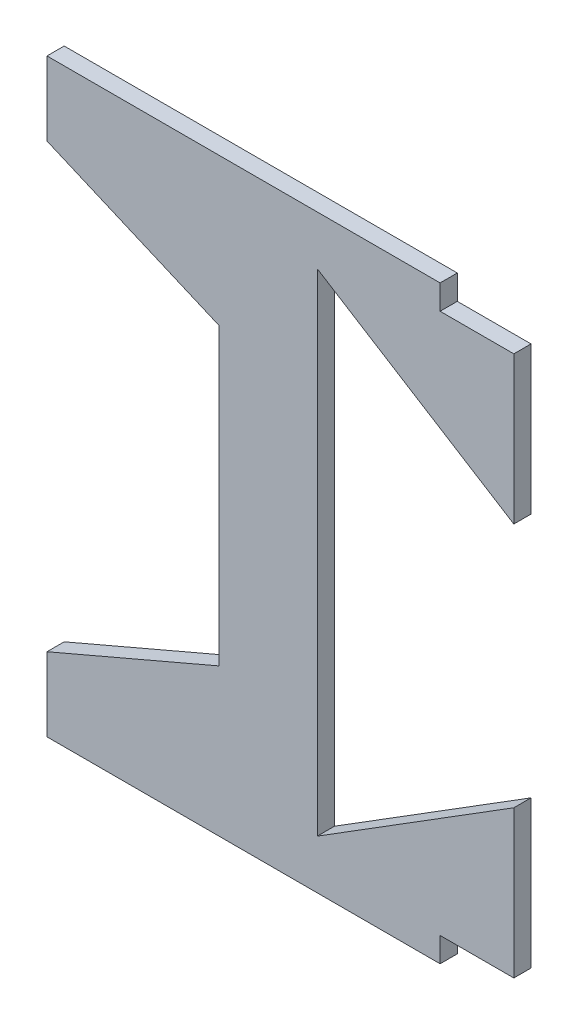
ISO-10303-21;
HEADER;
FILE_DESCRIPTION(('STEP AP214'),'2;1');
FILE_NAME('part.step','',(''),(''),'','','');
FILE_SCHEMA(('AUTOMOTIVE_DESIGN { 1 0 10303 214 1 1 1 1 }'));
ENDSEC;
DATA;
#1=APPLICATION_CONTEXT('core data for automotive mechanical design processes');
#2=APPLICATION_PROTOCOL_DEFINITION('international standard','automotive_design',2000,#1);
#3=PRODUCT_CONTEXT('',#1,'mechanical');
#4=PRODUCT('Part','Part','',(#3));
#5=PRODUCT_RELATED_PRODUCT_CATEGORY('part','',(#4));
#6=PRODUCT_DEFINITION_FORMATION('','',#4);
#7=PRODUCT_DEFINITION_CONTEXT('part definition',#1,'design');
#8=PRODUCT_DEFINITION('design','',#6,#7);
#9=PRODUCT_DEFINITION_SHAPE('','',#8);
#10=(LENGTH_UNIT() NAMED_UNIT(*) SI_UNIT(.MILLI.,.METRE.));
#11=(NAMED_UNIT(*) PLANE_ANGLE_UNIT() SI_UNIT($,.RADIAN.));
#12=(NAMED_UNIT(*) SI_UNIT($,.STERADIAN.) SOLID_ANGLE_UNIT());
#13=UNCERTAINTY_MEASURE_WITH_UNIT(LENGTH_MEASURE(1.E-05),#10,'distance_accuracy_value','');
#14=(GEOMETRIC_REPRESENTATION_CONTEXT(3) GLOBAL_UNCERTAINTY_ASSIGNED_CONTEXT((#13)) GLOBAL_UNIT_ASSIGNED_CONTEXT((#10,
#11,#12)) REPRESENTATION_CONTEXT('',''));
#15=CARTESIAN_POINT('',(0.,0.,0.));
#16=DIRECTION('',(0.,0.,1.));
#17=DIRECTION('',(1.,0.,0.));
#18=AXIS2_PLACEMENT_3D('',#15,#16,#17);
#19=CARTESIAN_POINT('',(30.2854704894107,-30.,3.5));
#20=DIRECTION('',(0.393919298579168,-0.919145030018058,0.));
#21=DIRECTION('',(0.919145030018058,0.393919298579168,0.));
#22=AXIS2_PLACEMENT_3D('',#19,#20,#21);
#23=PLANE('',#22);
#24=DIRECTION('',(-0.919145030018058,-0.393919298579168,0.));
#25=VECTOR('',#24,1.);
#26=CARTESIAN_POINT('',(30.2854704894107,-30.,0.));
#27=LINE('',#26,#25);
#28=CARTESIAN_POINT('',(30.2854704894107,-30.,0.));
#29=VERTEX_POINT('',#28);
#30=CARTESIAN_POINT('',(-4.71452951058928,-45.,0.));
#31=VERTEX_POINT('',#30);
#32=EDGE_CURVE('E188',#29,#31,#27,.T.);
#33=ORIENTED_EDGE('',*,*,#32,.T.);
#34=DIRECTION('',(0.,0.,-1.));
#35=VECTOR('',#34,1.);
#36=CARTESIAN_POINT('',(-4.71452951058928,-45.,3.5));
#37=LINE('',#36,#35);
#38=CARTESIAN_POINT('',(-4.71452951058928,-45.,3.5));
#39=VERTEX_POINT('',#38);
#40=EDGE_CURVE('E11',#39,#31,#37,.T.);
#41=ORIENTED_EDGE('',*,*,#40,.F.);
#42=DIRECTION('',(-0.919145030018058,-0.393919298579168,0.));
#43=VECTOR('',#42,1.);
#44=CARTESIAN_POINT('',(30.2854704894107,-30.,3.5));
#45=LINE('',#44,#43);
#46=CARTESIAN_POINT('',(30.2854704894107,-30.,3.5));
#47=VERTEX_POINT('',#46);
#48=EDGE_CURVE('E234',#47,#39,#45,.T.);
#49=ORIENTED_EDGE('',*,*,#48,.F.);
#50=DIRECTION('',(0.,0.,-1.));
#51=VECTOR('',#50,1.);
#52=CARTESIAN_POINT('',(30.2854704894107,-30.,3.5));
#53=LINE('',#52,#51);
#54=EDGE_CURVE('E184',#47,#29,#53,.T.);
#55=ORIENTED_EDGE('',*,*,#54,.T.);
#56=EDGE_LOOP('',(#33,#41,#49,#55));
#57=FACE_BOUND('',#56,.T.);
#58=ADVANCED_FACE('F39',(#57),#23,.F.);
#59=CARTESIAN_POINT('',(-4.71452951058928,-45.,3.5));
#60=DIRECTION('',(1.,0.,0.));
#61=DIRECTION('',(0.,1.,0.));
#62=AXIS2_PLACEMENT_3D('',#59,#60,#61);
#63=PLANE('',#62);
#64=DIRECTION('',(0.,-1.,0.));
#65=VECTOR('',#64,1.);
#66=CARTESIAN_POINT('',(-4.71452951058928,-45.,0.));
#67=LINE('',#66,#65);
#68=CARTESIAN_POINT('',(-4.71452951058927,-60.,0.));
#69=VERTEX_POINT('',#68);
#70=EDGE_CURVE('E192',#31,#69,#67,.T.);
#71=ORIENTED_EDGE('',*,*,#70,.T.);
#72=DIRECTION('',(0.,0.,-1.));
#73=VECTOR('',#72,1.);
#74=CARTESIAN_POINT('',(-4.71452951058927,-60.,3.5));
#75=LINE('',#74,#73);
#76=CARTESIAN_POINT('',(-4.71452951058927,-60.,3.5));
#77=VERTEX_POINT('',#76);
#78=EDGE_CURVE('E48',#77,#69,#75,.T.);
#79=ORIENTED_EDGE('',*,*,#78,.F.);
#80=DIRECTION('',(0.,-1.,0.));
#81=VECTOR('',#80,1.);
#82=CARTESIAN_POINT('',(-4.71452951058928,-45.,3.5));
#83=LINE('',#82,#81);
#84=EDGE_CURVE('E123',#39,#77,#83,.T.);
#85=ORIENTED_EDGE('',*,*,#84,.F.);
#86=ORIENTED_EDGE('',*,*,#40,.T.);
#87=EDGE_LOOP('',(#71,#79,#85,#86));
#88=FACE_BOUND('',#87,.T.);
#89=ADVANCED_FACE('F356',(#88),#63,.F.);
#90=CARTESIAN_POINT('',(-4.71452951058927,-60.,3.5));
#91=DIRECTION('',(0.,1.,0.));
#92=DIRECTION('',(0.,0.,1.));
#93=AXIS2_PLACEMENT_3D('',#90,#91,#92);
#94=PLANE('',#93);
#95=DIRECTION('',(1.,0.,0.));
#96=VECTOR('',#95,1.);
#97=CARTESIAN_POINT('',(-4.71452951058927,-60.,0.));
#98=LINE('',#97,#96);
#99=CARTESIAN_POINT('',(75.2854704894107,-60.,0.));
#100=VERTEX_POINT('',#99);
#101=EDGE_CURVE('E195',#69,#100,#98,.T.);
#102=ORIENTED_EDGE('',*,*,#101,.T.);
#103=DIRECTION('',(0.,0.,-1.));
#104=VECTOR('',#103,1.);
#105=CARTESIAN_POINT('',(75.2854704894107,-60.,3.5));
#106=LINE('',#105,#104);
#107=CARTESIAN_POINT('',(75.2854704894107,-60.,3.5));
#108=VERTEX_POINT('',#107);
#109=EDGE_CURVE('E277',#108,#100,#106,.T.);
#110=ORIENTED_EDGE('',*,*,#109,.F.);
#111=DIRECTION('',(1.,0.,0.));
#112=VECTOR('',#111,1.);
#113=CARTESIAN_POINT('',(-4.71452951058927,-60.,3.5));
#114=LINE('',#113,#112);
#115=EDGE_CURVE('E287',#77,#108,#114,.T.);
#116=ORIENTED_EDGE('',*,*,#115,.F.);
#117=ORIENTED_EDGE('',*,*,#78,.T.);
#118=EDGE_LOOP('',(#102,#110,#116,#117));
#119=FACE_BOUND('',#118,.T.);
#120=ADVANCED_FACE('F285',(#119),#94,.F.);
#121=CARTESIAN_POINT('',(75.2854704894107,-60.,3.5));
#122=DIRECTION('',(-1.,0.,0.));
#123=DIRECTION('',(0.,-1.,0.));
#124=AXIS2_PLACEMENT_3D('',#121,#122,#123);
#125=PLANE('',#124);
#126=DIRECTION('',(0.,1.,0.));
#127=VECTOR('',#126,1.);
#128=CARTESIAN_POINT('',(75.2854704894107,-60.,0.));
#129=LINE('',#128,#127);
#130=CARTESIAN_POINT('',(75.2854704894108,-55.,0.));
#131=VERTEX_POINT('',#130);
#132=EDGE_CURVE('E198',#100,#131,#129,.T.);
#133=ORIENTED_EDGE('',*,*,#132,.T.);
#134=DIRECTION('',(0.,0.,-1.));
#135=VECTOR('',#134,1.);
#136=CARTESIAN_POINT('',(75.2854704894108,-55.,3.5));
#137=LINE('',#136,#135);
#138=CARTESIAN_POINT('',(75.2854704894108,-55.,3.5));
#139=VERTEX_POINT('',#138);
#140=EDGE_CURVE('E273',#139,#131,#137,.T.);
#141=ORIENTED_EDGE('',*,*,#140,.F.);
#142=DIRECTION('',(0.,1.,0.));
#143=VECTOR('',#142,1.);
#144=CARTESIAN_POINT('',(75.2854704894107,-60.,3.5));
#145=LINE('',#144,#143);
#146=EDGE_CURVE('E306',#108,#139,#145,.T.);
#147=ORIENTED_EDGE('',*,*,#146,.F.);
#148=ORIENTED_EDGE('',*,*,#109,.T.);
#149=EDGE_LOOP('',(#133,#141,#147,#148));
#150=FACE_BOUND('',#149,.T.);
#151=ADVANCED_FACE('F296',(#150),#125,.F.);
#152=CARTESIAN_POINT('',(75.2854704894108,-55.,3.5));
#153=DIRECTION('',(0.,1.,0.));
#154=DIRECTION('',(0.,0.,1.));
#155=AXIS2_PLACEMENT_3D('',#152,#153,#154);
#156=PLANE('',#155);
#157=DIRECTION('',(1.,0.,0.));
#158=VECTOR('',#157,1.);
#159=CARTESIAN_POINT('',(75.2854704894108,-55.,0.));
#160=LINE('',#159,#158);
#161=CARTESIAN_POINT('',(90.2854704894108,-55.,0.));
#162=VERTEX_POINT('',#161);
#163=EDGE_CURVE('E201',#131,#162,#160,.T.);
#164=ORIENTED_EDGE('',*,*,#163,.T.);
#165=DIRECTION('',(0.,0.,-1.));
#166=VECTOR('',#165,1.);
#167=CARTESIAN_POINT('',(90.2854704894108,-55.,3.5));
#168=LINE('',#167,#166);
#169=CARTESIAN_POINT('',(90.2854704894108,-55.,3.5));
#170=VERTEX_POINT('',#169);
#171=EDGE_CURVE('E269',#170,#162,#168,.T.);
#172=ORIENTED_EDGE('',*,*,#171,.F.);
#173=DIRECTION('',(1.,0.,0.));
#174=VECTOR('',#173,1.);
#175=CARTESIAN_POINT('',(75.2854704894108,-55.,3.5));
#176=LINE('',#175,#174);
#177=EDGE_CURVE('E302',#139,#170,#176,.T.);
#178=ORIENTED_EDGE('',*,*,#177,.F.);
#179=ORIENTED_EDGE('',*,*,#140,.T.);
#180=EDGE_LOOP('',(#164,#172,#178,#179));
#181=FACE_BOUND('',#180,.T.);
#182=ADVANCED_FACE('F300',(#181),#156,.F.);
#183=CARTESIAN_POINT('',(90.2854704894108,-55.,3.5));
#184=DIRECTION('',(-1.,0.,0.));
#185=DIRECTION('',(0.,-1.,0.));
#186=AXIS2_PLACEMENT_3D('',#183,#184,#185);
#187=PLANE('',#186);
#188=DIRECTION('',(0.,1.,0.));
#189=VECTOR('',#188,1.);
#190=CARTESIAN_POINT('',(90.2854704894108,-55.,0.));
#191=LINE('',#190,#189);
#192=CARTESIAN_POINT('',(90.2854704894107,-25.,0.));
#193=VERTEX_POINT('',#192);
#194=EDGE_CURVE('E204',#162,#193,#191,.T.);
#195=ORIENTED_EDGE('',*,*,#194,.T.);
#196=DIRECTION('',(0.,0.,-1.));
#197=VECTOR('',#196,1.);
#198=CARTESIAN_POINT('',(90.2854704894107,-25.,3.5));
#199=LINE('',#198,#197);
#200=CARTESIAN_POINT('',(90.2854704894107,-25.,3.5));
#201=VERTEX_POINT('',#200);
#202=EDGE_CURVE('E265',#201,#193,#199,.T.);
#203=ORIENTED_EDGE('',*,*,#202,.F.);
#204=DIRECTION('',(0.,1.,0.));
#205=VECTOR('',#204,1.);
#206=CARTESIAN_POINT('',(90.2854704894108,-55.,3.5));
#207=LINE('',#206,#205);
#208=EDGE_CURVE('E305',#170,#201,#207,.T.);
#209=ORIENTED_EDGE('',*,*,#208,.F.);
#210=ORIENTED_EDGE('',*,*,#171,.T.);
#211=EDGE_LOOP('',(#195,#203,#209,#210));
#212=FACE_BOUND('',#211,.T.);
#213=ADVANCED_FACE('F369',(#212),#187,.F.);
#214=CARTESIAN_POINT('',(90.2854704894107,-25.,3.5));
#215=DIRECTION('',(0.52999894000318,-0.847998304005088,0.));
#216=DIRECTION('',(0.847998304005088,0.52999894000318,0.));
#217=AXIS2_PLACEMENT_3D('',#214,#215,#216);
#218=PLANE('',#217);
#219=DIRECTION('',(-0.847998304005088,-0.52999894000318,0.));
#220=VECTOR('',#219,1.);
#221=CARTESIAN_POINT('',(90.2854704894107,-25.,0.));
#222=LINE('',#221,#220);
#223=CARTESIAN_POINT('',(50.2854704894108,-50.,0.));
#224=VERTEX_POINT('',#223);
#225=EDGE_CURVE('E207',#193,#224,#222,.T.);
#226=ORIENTED_EDGE('',*,*,#225,.T.);
#227=DIRECTION('',(0.,0.,-1.));
#228=VECTOR('',#227,1.);
#229=CARTESIAN_POINT('',(50.2854704894108,-50.,3.5));
#230=LINE('',#229,#228);
#231=CARTESIAN_POINT('',(50.2854704894108,-50.,3.5));
#232=VERTEX_POINT('',#231);
#233=EDGE_CURVE('E261',#232,#224,#230,.T.);
#234=ORIENTED_EDGE('',*,*,#233,.F.);
#235=DIRECTION('',(-0.847998304005088,-0.52999894000318,0.));
#236=VECTOR('',#235,1.);
#237=CARTESIAN_POINT('',(90.2854704894107,-25.,3.5));
#238=LINE('',#237,#236);
#239=EDGE_CURVE('E310',#201,#232,#238,.T.);
#240=ORIENTED_EDGE('',*,*,#239,.F.);
#241=ORIENTED_EDGE('',*,*,#202,.T.);
#242=EDGE_LOOP('',(#226,#234,#240,#241));
#243=FACE_BOUND('',#242,.T.);
#244=ADVANCED_FACE('F372',(#243),#218,.F.);
#245=CARTESIAN_POINT('',(50.2854704894108,-50.,3.5));
#246=DIRECTION('',(-1.,0.,0.));
#247=DIRECTION('',(0.,0.,1.));
#248=AXIS2_PLACEMENT_3D('',#245,#246,#247);
#249=PLANE('',#248);
#250=DIRECTION('',(0.,1.,0.));
#251=VECTOR('',#250,1.);
#252=CARTESIAN_POINT('',(50.2854704894108,-50.,0.));
#253=LINE('',#252,#251);
#254=CARTESIAN_POINT('',(50.2854704894108,50.,0.));
#255=VERTEX_POINT('',#254);
#256=EDGE_CURVE('E210',#224,#255,#253,.T.);
#257=ORIENTED_EDGE('',*,*,#256,.T.);
#258=DIRECTION('',(0.,0.,-1.));
#259=VECTOR('',#258,1.);
#260=CARTESIAN_POINT('',(50.2854704894108,50.,3.5));
#261=LINE('',#260,#259);
#262=CARTESIAN_POINT('',(50.2854704894108,50.,3.5));
#263=VERTEX_POINT('',#262);
#264=EDGE_CURVE('E257',#263,#255,#261,.T.);
#265=ORIENTED_EDGE('',*,*,#264,.F.);
#266=DIRECTION('',(0.,1.,0.));
#267=VECTOR('',#266,1.);
#268=CARTESIAN_POINT('',(50.2854704894108,-50.,3.5));
#269=LINE('',#268,#267);
#270=EDGE_CURVE('E317',#232,#263,#269,.T.);
#271=ORIENTED_EDGE('',*,*,#270,.F.);
#272=ORIENTED_EDGE('',*,*,#233,.T.);
#273=EDGE_LOOP('',(#257,#265,#271,#272));
#274=FACE_BOUND('',#273,.T.);
#275=ADVANCED_FACE('F376',(#274),#249,.F.);
#276=CARTESIAN_POINT('',(90.2854704894107,25.,3.5));
#277=DIRECTION('',(0.52999894000318,0.847998304005088,0.));
#278=DIRECTION('',(-0.847998304005088,0.52999894000318,0.));
#279=AXIS2_PLACEMENT_3D('',#276,#277,#278);
#280=PLANE('',#279);
#281=DIRECTION('',(0.847998304005088,-0.52999894000318,0.));
#282=VECTOR('',#281,1.);
#283=CARTESIAN_POINT('',(90.2854704894107,25.,0.));
#284=LINE('',#283,#282);
#285=CARTESIAN_POINT('',(90.2854704894107,25.,0.));
#286=VERTEX_POINT('',#285);
#287=EDGE_CURVE('E213',#255,#286,#284,.T.);
#288=ORIENTED_EDGE('',*,*,#287,.T.);
#289=DIRECTION('',(0.,0.,-1.));
#290=VECTOR('',#289,1.);
#291=CARTESIAN_POINT('',(90.2854704894107,25.,3.5));
#292=LINE('',#291,#290);
#293=CARTESIAN_POINT('',(90.2854704894107,25.,3.5));
#294=VERTEX_POINT('',#293);
#295=EDGE_CURVE('E253',#294,#286,#292,.T.);
#296=ORIENTED_EDGE('',*,*,#295,.F.);
#297=DIRECTION('',(0.847998304005088,-0.52999894000318,0.));
#298=VECTOR('',#297,1.);
#299=CARTESIAN_POINT('',(90.2854704894107,25.,3.5));
#300=LINE('',#299,#298);
#301=EDGE_CURVE('E320',#263,#294,#300,.T.);
#302=ORIENTED_EDGE('',*,*,#301,.F.);
#303=ORIENTED_EDGE('',*,*,#264,.T.);
#304=EDGE_LOOP('',(#288,#296,#302,#303));
#305=FACE_BOUND('',#304,.T.);
#306=ADVANCED_FACE('F380',(#305),#280,.F.);
#307=CARTESIAN_POINT('',(90.2854704894108,55.,3.5));
#308=DIRECTION('',(-1.,0.,0.));
#309=DIRECTION('',(0.,-1.,0.));
#310=AXIS2_PLACEMENT_3D('',#307,#308,#309);
#311=PLANE('',#310);
#312=DIRECTION('',(0.,1.,0.));
#313=VECTOR('',#312,1.);
#314=CARTESIAN_POINT('',(90.2854704894108,55.,0.));
#315=LINE('',#314,#313);
#316=CARTESIAN_POINT('',(90.2854704894108,55.,0.));
#317=VERTEX_POINT('',#316);
#318=EDGE_CURVE('E216',#286,#317,#315,.T.);
#319=ORIENTED_EDGE('',*,*,#318,.T.);
#320=DIRECTION('',(0.,0.,-1.));
#321=VECTOR('',#320,1.);
#322=CARTESIAN_POINT('',(90.2854704894108,55.,3.5));
#323=LINE('',#322,#321);
#324=CARTESIAN_POINT('',(90.2854704894108,55.,3.5));
#325=VERTEX_POINT('',#324);
#326=EDGE_CURVE('E249',#325,#317,#323,.T.);
#327=ORIENTED_EDGE('',*,*,#326,.F.);
#328=DIRECTION('',(0.,1.,0.));
#329=VECTOR('',#328,1.);
#330=CARTESIAN_POINT('',(90.2854704894108,55.,3.5));
#331=LINE('',#330,#329);
#332=EDGE_CURVE('E323',#294,#325,#331,.T.);
#333=ORIENTED_EDGE('',*,*,#332,.F.);
#334=ORIENTED_EDGE('',*,*,#295,.T.);
#335=EDGE_LOOP('',(#319,#327,#333,#334));
#336=FACE_BOUND('',#335,.T.);
#337=ADVANCED_FACE('F384',(#336),#311,.F.);
#338=CARTESIAN_POINT('',(75.2854704894108,55.,3.5));
#339=DIRECTION('',(0.,-1.,0.));
#340=DIRECTION('',(0.,0.,-1.));
#341=AXIS2_PLACEMENT_3D('',#338,#339,#340);
#342=PLANE('',#341);
#343=DIRECTION('',(-1.,0.,0.));
#344=VECTOR('',#343,1.);
#345=CARTESIAN_POINT('',(75.2854704894108,55.,0.));
#346=LINE('',#345,#344);
#347=CARTESIAN_POINT('',(75.2854704894108,55.,0.));
#348=VERTEX_POINT('',#347);
#349=EDGE_CURVE('E219',#317,#348,#346,.T.);
#350=ORIENTED_EDGE('',*,*,#349,.T.);
#351=DIRECTION('',(0.,0.,-1.));
#352=VECTOR('',#351,1.);
#353=CARTESIAN_POINT('',(75.2854704894108,55.,3.5));
#354=LINE('',#353,#352);
#355=CARTESIAN_POINT('',(75.2854704894108,55.,3.5));
#356=VERTEX_POINT('',#355);
#357=EDGE_CURVE('E245',#356,#348,#354,.T.);
#358=ORIENTED_EDGE('',*,*,#357,.F.);
#359=DIRECTION('',(-1.,0.,0.));
#360=VECTOR('',#359,1.);
#361=CARTESIAN_POINT('',(75.2854704894108,55.,3.5));
#362=LINE('',#361,#360);
#363=EDGE_CURVE('E326',#325,#356,#362,.T.);
#364=ORIENTED_EDGE('',*,*,#363,.F.);
#365=ORIENTED_EDGE('',*,*,#326,.T.);
#366=EDGE_LOOP('',(#350,#358,#364,#365));
#367=FACE_BOUND('',#366,.T.);
#368=ADVANCED_FACE('F388',(#367),#342,.F.);
#369=CARTESIAN_POINT('',(75.2854704894107,60.,3.5));
#370=DIRECTION('',(-1.,0.,0.));
#371=DIRECTION('',(0.,-1.,0.));
#372=AXIS2_PLACEMENT_3D('',#369,#370,#371);
#373=PLANE('',#372);
#374=DIRECTION('',(0.,1.,0.));
#375=VECTOR('',#374,1.);
#376=CARTESIAN_POINT('',(75.2854704894107,60.,0.));
#377=LINE('',#376,#375);
#378=CARTESIAN_POINT('',(75.2854704894107,60.,0.));
#379=VERTEX_POINT('',#378);
#380=EDGE_CURVE('E222',#348,#379,#377,.T.);
#381=ORIENTED_EDGE('',*,*,#380,.T.);
#382=DIRECTION('',(0.,0.,-1.));
#383=VECTOR('',#382,1.);
#384=CARTESIAN_POINT('',(75.2854704894107,60.,3.5));
#385=LINE('',#384,#383);
#386=CARTESIAN_POINT('',(75.2854704894107,60.,3.5));
#387=VERTEX_POINT('',#386);
#388=EDGE_CURVE('E241',#387,#379,#385,.T.);
#389=ORIENTED_EDGE('',*,*,#388,.F.);
#390=DIRECTION('',(0.,1.,0.));
#391=VECTOR('',#390,1.);
#392=CARTESIAN_POINT('',(75.2854704894107,60.,3.5));
#393=LINE('',#392,#391);
#394=EDGE_CURVE('E329',#356,#387,#393,.T.);
#395=ORIENTED_EDGE('',*,*,#394,.F.);
#396=ORIENTED_EDGE('',*,*,#357,.T.);
#397=EDGE_LOOP('',(#381,#389,#395,#396));
#398=FACE_BOUND('',#397,.T.);
#399=ADVANCED_FACE('F337',(#398),#373,.F.);
#400=CARTESIAN_POINT('',(-4.71452951058927,60.,3.5));
#401=DIRECTION('',(0.,-1.,0.));
#402=DIRECTION('',(0.,0.,-1.));
#403=AXIS2_PLACEMENT_3D('',#400,#401,#402);
#404=PLANE('',#403);
#405=DIRECTION('',(-1.,0.,0.));
#406=VECTOR('',#405,1.);
#407=CARTESIAN_POINT('',(-4.71452951058927,60.,0.));
#408=LINE('',#407,#406);
#409=CARTESIAN_POINT('',(-4.71452951058927,60.,0.));
#410=VERTEX_POINT('',#409);
#411=EDGE_CURVE('E225',#379,#410,#408,.T.);
#412=ORIENTED_EDGE('',*,*,#411,.T.);
#413=DIRECTION('',(0.,0.,-1.));
#414=VECTOR('',#413,1.);
#415=CARTESIAN_POINT('',(-4.71452951058927,60.,3.5));
#416=LINE('',#415,#414);
#417=CARTESIAN_POINT('',(-4.71452951058927,60.,3.5));
#418=VERTEX_POINT('',#417);
#419=EDGE_CURVE('E177',#418,#410,#416,.T.);
#420=ORIENTED_EDGE('',*,*,#419,.F.);
#421=DIRECTION('',(-1.,0.,0.));
#422=VECTOR('',#421,1.);
#423=CARTESIAN_POINT('',(-4.71452951058927,60.,3.5));
#424=LINE('',#423,#422);
#425=EDGE_CURVE('E166',#387,#418,#424,.T.);
#426=ORIENTED_EDGE('',*,*,#425,.F.);
#427=ORIENTED_EDGE('',*,*,#388,.T.);
#428=EDGE_LOOP('',(#412,#420,#426,#427));
#429=FACE_BOUND('',#428,.T.);
#430=ADVANCED_FACE('F341',(#429),#404,.F.);
#431=CARTESIAN_POINT('',(-4.71452951058928,45.,3.5));
#432=DIRECTION('',(1.,0.,0.));
#433=DIRECTION('',(0.,1.,0.));
#434=AXIS2_PLACEMENT_3D('',#431,#432,#433);
#435=PLANE('',#434);
#436=DIRECTION('',(0.,-1.,0.));
#437=VECTOR('',#436,1.);
#438=CARTESIAN_POINT('',(-4.71452951058928,45.,0.));
#439=LINE('',#438,#437);
#440=CARTESIAN_POINT('',(-4.71452951058928,45.,0.));
#441=VERTEX_POINT('',#440);
#442=EDGE_CURVE('E175',#410,#441,#439,.T.);
#443=ORIENTED_EDGE('',*,*,#442,.T.);
#444=DIRECTION('',(0.,0.,-1.));
#445=VECTOR('',#444,1.);
#446=CARTESIAN_POINT('',(-4.71452951058928,45.,3.5));
#447=LINE('',#446,#445);
#448=CARTESIAN_POINT('',(-4.71452951058928,45.,3.5));
#449=VERTEX_POINT('',#448);
#450=EDGE_CURVE('E172',#449,#441,#447,.T.);
#451=ORIENTED_EDGE('',*,*,#450,.F.);
#452=DIRECTION('',(0.,-1.,0.));
#453=VECTOR('',#452,1.);
#454=CARTESIAN_POINT('',(-4.71452951058928,45.,3.5));
#455=LINE('',#454,#453);
#456=EDGE_CURVE('E160',#418,#449,#455,.T.);
#457=ORIENTED_EDGE('',*,*,#456,.F.);
#458=ORIENTED_EDGE('',*,*,#419,.T.);
#459=EDGE_LOOP('',(#443,#451,#457,#458));
#460=FACE_BOUND('',#459,.T.);
#461=ADVANCED_FACE('F173',(#460),#435,.F.);
#462=CARTESIAN_POINT('',(30.2854704894107,30.,3.5));
#463=DIRECTION('',(0.393919298579168,0.919145030018058,0.));
#464=DIRECTION('',(-0.919145030018058,0.393919298579168,0.));
#465=AXIS2_PLACEMENT_3D('',#462,#463,#464);
#466=PLANE('',#465);
#467=DIRECTION('',(0.919145030018058,-0.393919298579168,0.));
#468=VECTOR('',#467,1.);
#469=CARTESIAN_POINT('',(30.2854704894107,30.,0.));
#470=LINE('',#469,#468);
#471=CARTESIAN_POINT('',(30.2854704894107,30.,0.));
#472=VERTEX_POINT('',#471);
#473=EDGE_CURVE('E109',#441,#472,#470,.T.);
#474=ORIENTED_EDGE('',*,*,#473,.T.);
#475=DIRECTION('',(0.,0.,-1.));
#476=VECTOR('',#475,1.);
#477=CARTESIAN_POINT('',(30.2854704894107,30.,3.5));
#478=LINE('',#477,#476);
#479=CARTESIAN_POINT('',(30.2854704894107,30.,3.5));
#480=VERTEX_POINT('',#479);
#481=EDGE_CURVE('E178',#480,#472,#478,.T.);
#482=ORIENTED_EDGE('',*,*,#481,.F.);
#483=DIRECTION('',(0.919145030018058,-0.393919298579168,0.));
#484=VECTOR('',#483,1.);
#485=CARTESIAN_POINT('',(30.2854704894107,30.,3.5));
#486=LINE('',#485,#484);
#487=EDGE_CURVE('E164',#449,#480,#486,.T.);
#488=ORIENTED_EDGE('',*,*,#487,.F.);
#489=ORIENTED_EDGE('',*,*,#450,.T.);
#490=EDGE_LOOP('',(#474,#482,#488,#489));
#491=FACE_BOUND('',#490,.T.);
#492=ADVANCED_FACE('F180',(#491),#466,.F.);
#493=CARTESIAN_POINT('',(30.2854704894107,30.,3.5));
#494=DIRECTION('',(1.,0.,0.));
#495=DIRECTION('',(0.,0.,-1.));
#496=AXIS2_PLACEMENT_3D('',#493,#494,#495);
#497=PLANE('',#496);
#498=DIRECTION('',(0.,-1.,0.));
#499=VECTOR('',#498,1.);
#500=CARTESIAN_POINT('',(30.2854704894107,30.,0.));
#501=LINE('',#500,#499);
#502=EDGE_CURVE('E115',#472,#29,#501,.T.);
#503=ORIENTED_EDGE('',*,*,#502,.T.);
#504=ORIENTED_EDGE('',*,*,#54,.F.);
#505=DIRECTION('',(0.,-1.,0.));
#506=VECTOR('',#505,1.);
#507=CARTESIAN_POINT('',(30.2854704894107,30.,3.5));
#508=LINE('',#507,#506);
#509=EDGE_CURVE('E56',#480,#47,#508,.T.);
#510=ORIENTED_EDGE('',*,*,#509,.F.);
#511=ORIENTED_EDGE('',*,*,#481,.T.);
#512=EDGE_LOOP('',(#503,#504,#510,#511));
#513=FACE_BOUND('',#512,.T.);
#514=ADVANCED_FACE('F345',(#513),#497,.F.);
#515=CARTESIAN_POINT('',(0.,0.,3.5));
#516=DIRECTION('',(0.,0.,1.));
#517=DIRECTION('',(1.,0.,0.));
#518=AXIS2_PLACEMENT_3D('',#515,#516,#517);
#519=PLANE('',#518);
#520=ORIENTED_EDGE('',*,*,#48,.T.);
#521=ORIENTED_EDGE('',*,*,#84,.T.);
#522=ORIENTED_EDGE('',*,*,#115,.T.);
#523=ORIENTED_EDGE('',*,*,#146,.T.);
#524=ORIENTED_EDGE('',*,*,#177,.T.);
#525=ORIENTED_EDGE('',*,*,#208,.T.);
#526=ORIENTED_EDGE('',*,*,#239,.T.);
#527=ORIENTED_EDGE('',*,*,#270,.T.);
#528=ORIENTED_EDGE('',*,*,#301,.T.);
#529=ORIENTED_EDGE('',*,*,#332,.T.);
#530=ORIENTED_EDGE('',*,*,#363,.T.);
#531=ORIENTED_EDGE('',*,*,#394,.T.);
#532=ORIENTED_EDGE('',*,*,#425,.T.);
#533=ORIENTED_EDGE('',*,*,#456,.T.);
#534=ORIENTED_EDGE('',*,*,#487,.T.);
#535=ORIENTED_EDGE('',*,*,#509,.T.);
#536=EDGE_LOOP('',(#520,#521,#522,#523,#524,#525,#526,#527,#528,#529,#530,#531,#532,#533,#534,#535));
#537=FACE_BOUND('',#536,.T.);
#538=ADVANCED_FACE('F162',(#537),#519,.T.);
#539=CARTESIAN_POINT('',(0.,0.,0.));
#540=DIRECTION('',(0.,0.,1.));
#541=DIRECTION('',(1.,0.,0.));
#542=AXIS2_PLACEMENT_3D('',#539,#540,#541);
#543=PLANE('',#542);
#544=ORIENTED_EDGE('',*,*,#32,.F.);
#545=ORIENTED_EDGE('',*,*,#502,.F.);
#546=ORIENTED_EDGE('',*,*,#473,.F.);
#547=ORIENTED_EDGE('',*,*,#442,.F.);
#548=ORIENTED_EDGE('',*,*,#411,.F.);
#549=ORIENTED_EDGE('',*,*,#380,.F.);
#550=ORIENTED_EDGE('',*,*,#349,.F.);
#551=ORIENTED_EDGE('',*,*,#318,.F.);
#552=ORIENTED_EDGE('',*,*,#287,.F.);
#553=ORIENTED_EDGE('',*,*,#256,.F.);
#554=ORIENTED_EDGE('',*,*,#225,.F.);
#555=ORIENTED_EDGE('',*,*,#194,.F.);
#556=ORIENTED_EDGE('',*,*,#163,.F.);
#557=ORIENTED_EDGE('',*,*,#132,.F.);
#558=ORIENTED_EDGE('',*,*,#101,.F.);
#559=ORIENTED_EDGE('',*,*,#70,.F.);
#560=EDGE_LOOP('',(#544,#545,#546,#547,#548,#549,#550,#551,#552,#553,#554,#555,#556,#557,#558,#559));
#561=FACE_BOUND('',#560,.T.);
#562=ADVANCED_FACE('F291',(#561),#543,.F.);
#563=CLOSED_SHELL('',(#58,#89,#120,#151,#182,#213,#244,#275,#306,#337,#368,#399,#430,#461,#492,
#514,#538,#562));
#564=MANIFOLD_SOLID_BREP('B2',#563);
#565=ADVANCED_BREP_SHAPE_REPRESENTATION('',(#18,#564),#14);
#566=SHAPE_DEFINITION_REPRESENTATION(#9,#565);
ENDSEC;
END-ISO-10303-21;
